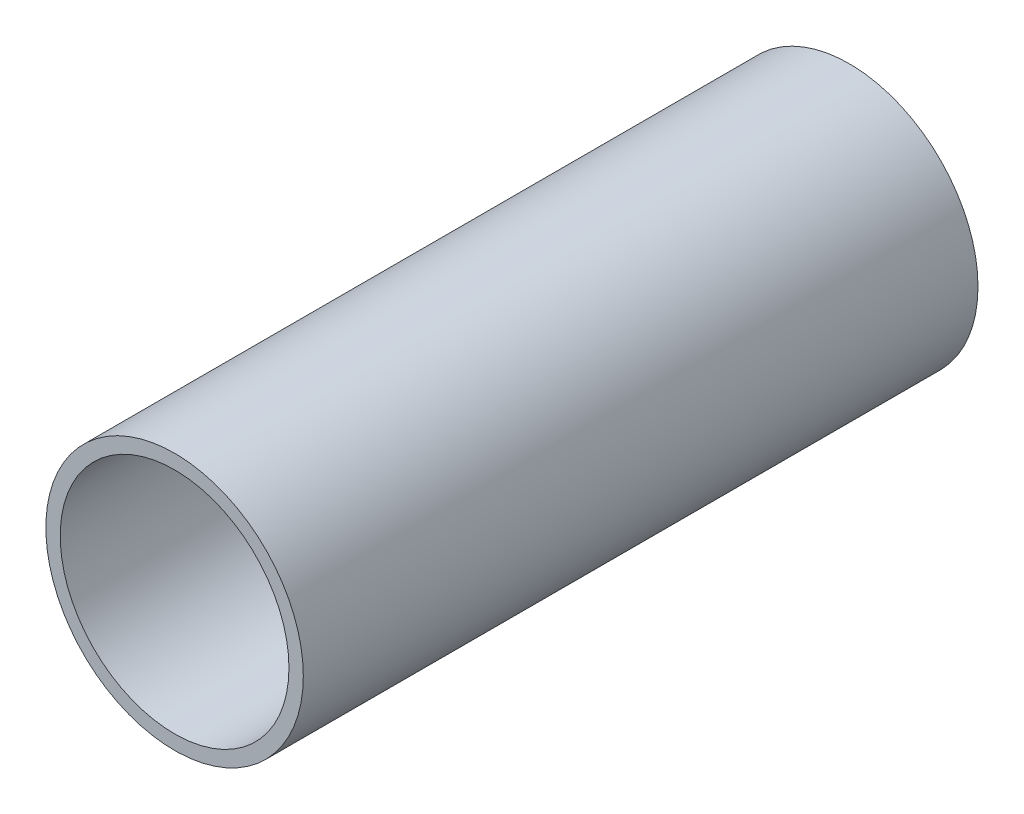
ISO-10303-21;
HEADER;
FILE_DESCRIPTION(('STEP AP214'),'2;1');
FILE_NAME('part.step','',(''),(''),'','','');
FILE_SCHEMA(('AUTOMOTIVE_DESIGN { 1 0 10303 214 1 1 1 1 }'));
ENDSEC;
DATA;
#1=APPLICATION_CONTEXT('core data for automotive mechanical design processes');
#2=APPLICATION_PROTOCOL_DEFINITION('international standard','automotive_design',2000,#1);
#3=PRODUCT_CONTEXT('',#1,'mechanical');
#4=PRODUCT('Part','Part','',(#3));
#5=PRODUCT_RELATED_PRODUCT_CATEGORY('part','',(#4));
#6=PRODUCT_DEFINITION_FORMATION('','',#4);
#7=PRODUCT_DEFINITION_CONTEXT('part definition',#1,'design');
#8=PRODUCT_DEFINITION('design','',#6,#7);
#9=PRODUCT_DEFINITION_SHAPE('','',#8);
#10=(LENGTH_UNIT() NAMED_UNIT(*) SI_UNIT(.MILLI.,.METRE.));
#11=(NAMED_UNIT(*) PLANE_ANGLE_UNIT() SI_UNIT($,.RADIAN.));
#12=(NAMED_UNIT(*) SI_UNIT($,.STERADIAN.) SOLID_ANGLE_UNIT());
#13=UNCERTAINTY_MEASURE_WITH_UNIT(LENGTH_MEASURE(1.E-05),#10,'distance_accuracy_value','');
#14=(GEOMETRIC_REPRESENTATION_CONTEXT(3) GLOBAL_UNCERTAINTY_ASSIGNED_CONTEXT((#13)) GLOBAL_UNIT_ASSIGNED_CONTEXT((#10,
#11,#12)) REPRESENTATION_CONTEXT('',''));
#15=CARTESIAN_POINT('',(0.,0.,0.));
#16=DIRECTION('',(0.,0.,1.));
#17=DIRECTION('',(1.,0.,0.));
#18=AXIS2_PLACEMENT_3D('',#15,#16,#17);
#19=CARTESIAN_POINT('',(0.,0.,0.));
#20=DIRECTION('',(0.,0.,1.));
#21=DIRECTION('',(1.,0.,0.));
#22=AXIS2_PLACEMENT_3D('',#19,#20,#21);
#23=CYLINDRICAL_SURFACE('',#22,50.595);
#24=CARTESIAN_POINT('',(0.,0.,0.));
#25=DIRECTION('',(0.,0.,1.));
#26=DIRECTION('',(1.,0.,0.));
#27=AXIS2_PLACEMENT_3D('',#24,#25,#26);
#28=CIRCLE('',#27,50.595);
#29=CARTESIAN_POINT('',(50.595,0.,0.));
#30=VERTEX_POINT('',#29);
#31=EDGE_CURVE('E57',#30,#30,#28,.T.);
#32=ORIENTED_EDGE('',*,*,#31,.T.);
#33=EDGE_LOOP('',(#32));
#34=FACE_BOUND('',#33,.T.);
#35=CARTESIAN_POINT('',(0.,0.,-298.45));
#36=DIRECTION('',(0.,0.,1.));
#37=DIRECTION('',(1.,0.,0.));
#38=AXIS2_PLACEMENT_3D('',#35,#36,#37);
#39=CIRCLE('',#38,50.595);
#40=CARTESIAN_POINT('',(50.595,0.,-298.45));
#41=VERTEX_POINT('',#40);
#42=EDGE_CURVE('E10',#41,#41,#39,.T.);
#43=ORIENTED_EDGE('',*,*,#42,.F.);
#44=EDGE_LOOP('',(#43));
#45=FACE_BOUND('',#44,.T.);
#46=ADVANCED_FACE('F39',(#34,#45),#23,.F.);
#47=CARTESIAN_POINT('',(50.595,0.,-298.45));
#48=DIRECTION('',(0.,0.,-1.));
#49=DIRECTION('',(-1.,0.,0.));
#50=AXIS2_PLACEMENT_3D('',#47,#48,#49);
#51=PLANE('',#50);
#52=ORIENTED_EDGE('',*,*,#42,.T.);
#53=EDGE_LOOP('',(#52));
#54=FACE_BOUND('',#53,.T.);
#55=CARTESIAN_POINT('',(0.,0.,-298.45));
#56=DIRECTION('',(0.,0.,1.));
#57=DIRECTION('',(1.,0.,0.));
#58=AXIS2_PLACEMENT_3D('',#55,#56,#57);
#59=CIRCLE('',#58,56.945);
#60=CARTESIAN_POINT('',(56.945,0.,-298.45));
#61=VERTEX_POINT('',#60);
#62=EDGE_CURVE('E46',#61,#61,#59,.T.);
#63=ORIENTED_EDGE('',*,*,#62,.F.);
#64=EDGE_LOOP('',(#63));
#65=FACE_BOUND('',#64,.T.);
#66=ADVANCED_FACE('F73',(#54,#65),#51,.T.);
#67=CARTESIAN_POINT('',(0.,0.,0.));
#68=DIRECTION('',(0.,0.,1.));
#69=DIRECTION('',(1.,0.,0.));
#70=AXIS2_PLACEMENT_3D('',#67,#68,#69);
#71=CYLINDRICAL_SURFACE('',#70,56.945);
#72=ORIENTED_EDGE('',*,*,#62,.T.);
#73=EDGE_LOOP('',(#72));
#74=FACE_BOUND('',#73,.T.);
#75=CARTESIAN_POINT('',(0.,0.,0.));
#76=DIRECTION('',(0.,0.,1.));
#77=DIRECTION('',(1.,0.,0.));
#78=AXIS2_PLACEMENT_3D('',#75,#76,#77);
#79=CIRCLE('',#78,56.945);
#80=CARTESIAN_POINT('',(56.945,0.,0.));
#81=VERTEX_POINT('',#80);
#82=EDGE_CURVE('E52',#81,#81,#79,.T.);
#83=ORIENTED_EDGE('',*,*,#82,.F.);
#84=EDGE_LOOP('',(#83));
#85=FACE_BOUND('',#84,.T.);
#86=ADVANCED_FACE('F67',(#74,#85),#71,.T.);
#87=CARTESIAN_POINT('',(50.595,0.,0.));
#88=DIRECTION('',(0.,0.,1.));
#89=DIRECTION('',(1.,0.,0.));
#90=AXIS2_PLACEMENT_3D('',#87,#88,#89);
#91=PLANE('',#90);
#92=ORIENTED_EDGE('',*,*,#82,.T.);
#93=EDGE_LOOP('',(#92));
#94=FACE_BOUND('',#93,.T.);
#95=ORIENTED_EDGE('',*,*,#31,.F.);
#96=EDGE_LOOP('',(#95));
#97=FACE_BOUND('',#96,.T.);
#98=ADVANCED_FACE('F65',(#94,#97),#91,.T.);
#99=CLOSED_SHELL('',(#46,#66,#86,#98));
#100=MANIFOLD_SOLID_BREP('B2',#99);
#101=ADVANCED_BREP_SHAPE_REPRESENTATION('',(#18,#100),#14);
#102=SHAPE_DEFINITION_REPRESENTATION(#9,#101);
ENDSEC;
END-ISO-10303-21;
